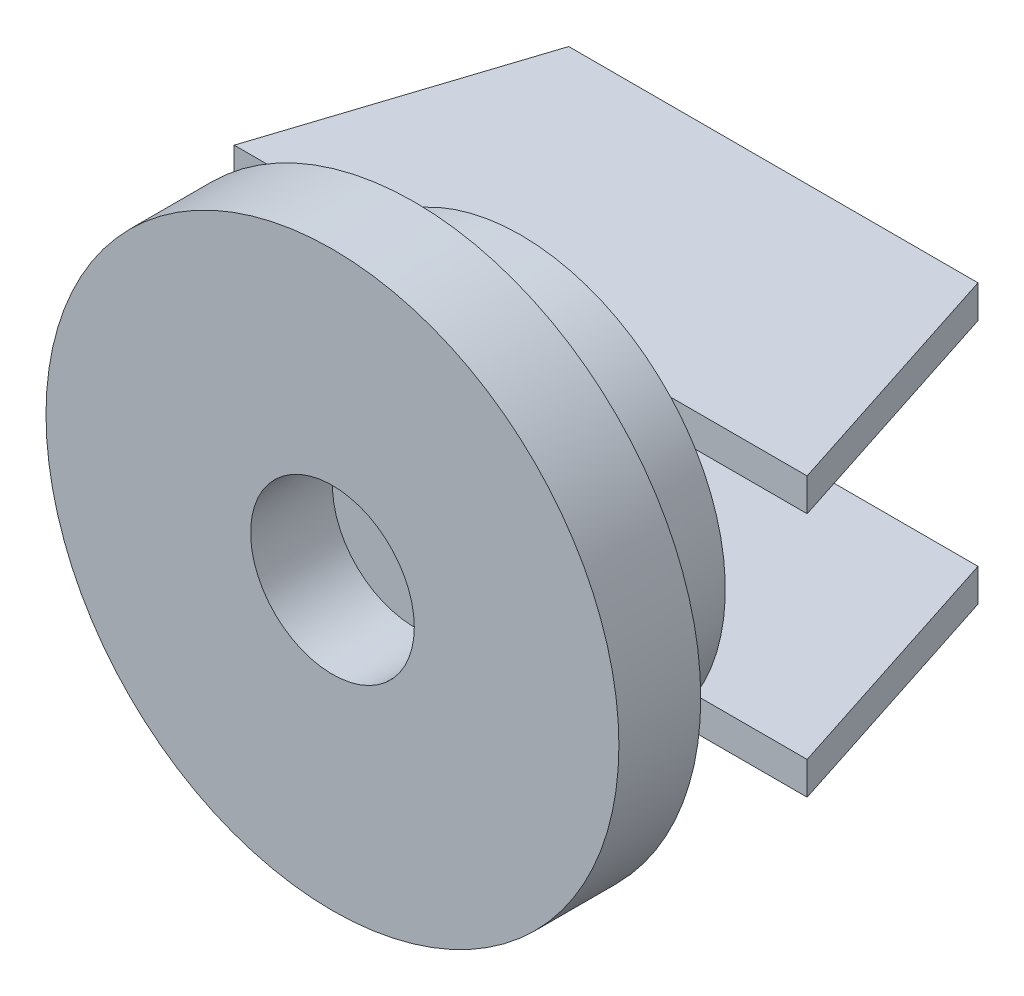
ISO-10303-21;
HEADER;
FILE_DESCRIPTION(('STEP AP214'),'2;1');
FILE_NAME('part.step','',(''),(''),'','','');
FILE_SCHEMA(('AUTOMOTIVE_DESIGN { 1 0 10303 214 1 1 1 1 }'));
ENDSEC;
DATA;
#1=APPLICATION_CONTEXT('core data for automotive mechanical design processes');
#2=APPLICATION_PROTOCOL_DEFINITION('international standard','automotive_design',2000,#1);
#3=PRODUCT_CONTEXT('',#1,'mechanical');
#4=PRODUCT('Part','Part','',(#3));
#5=PRODUCT_RELATED_PRODUCT_CATEGORY('part','',(#4));
#6=PRODUCT_DEFINITION_FORMATION('','',#4);
#7=PRODUCT_DEFINITION_CONTEXT('part definition',#1,'design');
#8=PRODUCT_DEFINITION('design','',#6,#7);
#9=PRODUCT_DEFINITION_SHAPE('','',#8);
#10=(LENGTH_UNIT() NAMED_UNIT(*) SI_UNIT(.MILLI.,.METRE.));
#11=(NAMED_UNIT(*) PLANE_ANGLE_UNIT() SI_UNIT($,.RADIAN.));
#12=(NAMED_UNIT(*) SI_UNIT($,.STERADIAN.) SOLID_ANGLE_UNIT());
#13=UNCERTAINTY_MEASURE_WITH_UNIT(LENGTH_MEASURE(1.E-05),#10,'distance_accuracy_value','');
#14=(GEOMETRIC_REPRESENTATION_CONTEXT(3) GLOBAL_UNCERTAINTY_ASSIGNED_CONTEXT((#13)) GLOBAL_UNIT_ASSIGNED_CONTEXT((#10,
#11,#12)) REPRESENTATION_CONTEXT('',''));
#15=CARTESIAN_POINT('',(0.,0.,0.));
#16=DIRECTION('',(0.,0.,1.));
#17=DIRECTION('',(1.,0.,0.));
#18=AXIS2_PLACEMENT_3D('',#15,#16,#17);
#19=CARTESIAN_POINT('',(0.,0.,-11.5));
#20=DIRECTION('',(0.,0.,-1.));
#21=DIRECTION('',(-1.,0.,0.));
#22=AXIS2_PLACEMENT_3D('',#19,#20,#21);
#23=PLANE('',#22);
#24=CARTESIAN_POINT('',(0.,0.,-11.5));
#25=DIRECTION('',(0.,0.,-1.));
#26=DIRECTION('',(-1.,0.,0.));
#27=AXIS2_PLACEMENT_3D('',#24,#25,#26);
#28=CIRCLE('',#27,6.5);
#29=CARTESIAN_POINT('',(0.,6.5,-11.5));
#30=VERTEX_POINT('',#29);
#31=CARTESIAN_POINT('',(0.,-6.5,-11.5));
#32=VERTEX_POINT('',#31);
#33=EDGE_CURVE('E31',#30,#32,#28,.T.);
#34=ORIENTED_EDGE('',*,*,#33,.F.);
#35=DIRECTION('',(-1.,0.,0.));
#36=VECTOR('',#35,1.);
#37=CARTESIAN_POINT('',(0.,6.5,-11.5));
#38=LINE('',#37,#36);
#39=CARTESIAN_POINT('',(10.6770782520313,6.5,-11.5));
#40=VERTEX_POINT('',#39);
#41=EDGE_CURVE('E38',#40,#30,#38,.T.);
#42=ORIENTED_EDGE('',*,*,#41,.F.);
#43=CARTESIAN_POINT('',(0.,0.,-11.5));
#44=DIRECTION('',(0.,0.,-1.));
#45=DIRECTION('',(-1.,0.,0.));
#46=AXIS2_PLACEMENT_3D('',#43,#44,#45);
#47=CIRCLE('',#46,12.5);
#48=CARTESIAN_POINT('',(10.6770782520313,-6.5,-11.5));
#49=VERTEX_POINT('',#48);
#50=EDGE_CURVE('E192',#40,#49,#47,.T.);
#51=ORIENTED_EDGE('',*,*,#50,.T.);
#52=DIRECTION('',(1.,0.,0.));
#53=VECTOR('',#52,1.);
#54=CARTESIAN_POINT('',(-17.5,-6.5,-11.5));
#55=LINE('',#54,#53);
#56=EDGE_CURVE('E116',#32,#49,#55,.T.);
#57=ORIENTED_EDGE('',*,*,#56,.F.);
#58=EDGE_LOOP('',(#34,#42,#51,#57));
#59=FACE_BOUND('',#58,.T.);
#60=ADVANCED_FACE('F17',(#59),#23,.T.);
#61=CARTESIAN_POINT('',(-9.16515138991169,8.5,-11.5));
#62=VERTEX_POINT('',#61);
#63=CARTESIAN_POINT('',(9.16515138991169,8.5,-11.5));
#64=VERTEX_POINT('',#63);
#65=EDGE_CURVE('E339',#62,#64,#47,.T.);
#66=ORIENTED_EDGE('',*,*,#65,.T.);
#67=DIRECTION('',(-1.,0.,0.));
#68=VECTOR('',#67,1.);
#69=CARTESIAN_POINT('',(0.,8.5,-11.5));
#70=LINE('',#69,#68);
#71=EDGE_CURVE('E134',#64,#62,#70,.T.);
#72=ORIENTED_EDGE('',*,*,#71,.T.);
#73=EDGE_LOOP('',(#66,#72));
#74=FACE_BOUND('',#73,.T.);
#75=ADVANCED_FACE('F225',(#74),#23,.T.);
#76=CARTESIAN_POINT('',(9.16515138991169,-8.5,-11.5));
#77=VERTEX_POINT('',#76);
#78=CARTESIAN_POINT('',(-9.16515138991169,-8.5,-11.5));
#79=VERTEX_POINT('',#78);
#80=EDGE_CURVE('E202',#77,#79,#47,.T.);
#81=ORIENTED_EDGE('',*,*,#80,.T.);
#82=DIRECTION('',(1.,0.,0.));
#83=VECTOR('',#82,1.);
#84=CARTESIAN_POINT('',(-17.5,-8.5,-11.5));
#85=LINE('',#84,#83);
#86=EDGE_CURVE('E183',#79,#77,#85,.T.);
#87=ORIENTED_EDGE('',*,*,#86,.T.);
#88=EDGE_LOOP('',(#81,#87));
#89=FACE_BOUND('',#88,.T.);
#90=ADVANCED_FACE('F216',(#89),#23,.T.);
#91=CARTESIAN_POINT('',(0.,0.,-5.));
#92=DIRECTION('',(0.,0.,1.));
#93=DIRECTION('',(1.,0.,0.));
#94=AXIS2_PLACEMENT_3D('',#91,#92,#93);
#95=CYLINDRICAL_SURFACE('',#94,17.5);
#96=CARTESIAN_POINT('',(0.,0.,-5.));
#97=DIRECTION('',(0.,0.,1.));
#98=DIRECTION('',(1.,0.,0.));
#99=AXIS2_PLACEMENT_3D('',#96,#97,#98);
#100=CIRCLE('',#99,17.5);
#101=CARTESIAN_POINT('',(17.5,0.,-5.));
#102=VERTEX_POINT('',#101);
#103=EDGE_CURVE('E205',#102,#102,#100,.T.);
#104=ORIENTED_EDGE('',*,*,#103,.T.);
#105=EDGE_LOOP('',(#104));
#106=FACE_BOUND('',#105,.T.);
#107=CARTESIAN_POINT('',(0.,0.,0.));
#108=DIRECTION('',(0.,0.,1.));
#109=DIRECTION('',(1.,0.,0.));
#110=AXIS2_PLACEMENT_3D('',#107,#108,#109);
#111=CIRCLE('',#110,17.5);
#112=CARTESIAN_POINT('',(17.5,0.,0.));
#113=VERTEX_POINT('',#112);
#114=EDGE_CURVE('E137',#113,#113,#111,.T.);
#115=ORIENTED_EDGE('',*,*,#114,.F.);
#116=EDGE_LOOP('',(#115));
#117=FACE_BOUND('',#116,.T.);
#118=ADVANCED_FACE('F19',(#106,#117),#95,.T.);
#119=CARTESIAN_POINT('',(0.,0.,-5.));
#120=DIRECTION('',(0.,0.,1.));
#121=DIRECTION('',(1.,0.,0.));
#122=AXIS2_PLACEMENT_3D('',#119,#120,#121);
#123=PLANE('',#122);
#124=CARTESIAN_POINT('',(0.,0.,-5.));
#125=DIRECTION('',(0.,0.,-1.));
#126=DIRECTION('',(-1.,0.,0.));
#127=AXIS2_PLACEMENT_3D('',#124,#125,#126);
#128=CIRCLE('',#127,12.5);
#129=CARTESIAN_POINT('',(-12.5,0.,-5.));
#130=VERTEX_POINT('',#129);
#131=EDGE_CURVE('E203',#130,#130,#128,.T.);
#132=ORIENTED_EDGE('',*,*,#131,.F.);
#133=EDGE_LOOP('',(#132));
#134=FACE_BOUND('',#133,.T.);
#135=ORIENTED_EDGE('',*,*,#103,.F.);
#136=EDGE_LOOP('',(#135));
#137=FACE_BOUND('',#136,.T.);
#138=ADVANCED_FACE('F215',(#134,#137),#123,.F.);
#139=CARTESIAN_POINT('',(0.,0.,0.));
#140=DIRECTION('',(0.,0.,1.));
#141=DIRECTION('',(1.,0.,0.));
#142=AXIS2_PLACEMENT_3D('',#139,#140,#141);
#143=PLANE('',#142);
#144=CARTESIAN_POINT('',(0.,0.,0.));
#145=DIRECTION('',(0.,0.,1.));
#146=DIRECTION('',(1.,0.,0.));
#147=AXIS2_PLACEMENT_3D('',#144,#145,#146);
#148=CIRCLE('',#147,5.);
#149=CARTESIAN_POINT('',(5.,0.,0.));
#150=VERTEX_POINT('',#149);
#151=EDGE_CURVE('E292',#150,#150,#148,.T.);
#152=ORIENTED_EDGE('',*,*,#151,.F.);
#153=EDGE_LOOP('',(#152));
#154=FACE_BOUND('',#153,.T.);
#155=ORIENTED_EDGE('',*,*,#114,.T.);
#156=EDGE_LOOP('',(#155));
#157=FACE_BOUND('',#156,.T.);
#158=ADVANCED_FACE('F212',(#154,#157),#143,.T.);
#159=CARTESIAN_POINT('',(0.,0.,-11.5));
#160=DIRECTION('',(0.,0.,1.));
#161=DIRECTION('',(1.,0.,0.));
#162=AXIS2_PLACEMENT_3D('',#159,#160,#161);
#163=CYLINDRICAL_SURFACE('',#162,12.5);
#164=EDGE_CURVE('E199',#49,#77,#47,.T.);
#165=ORIENTED_EDGE('',*,*,#164,.F.);
#166=ORIENTED_EDGE('',*,*,#50,.F.);
#167=EDGE_CURVE('E341',#64,#40,#47,.T.);
#168=ORIENTED_EDGE('',*,*,#167,.F.);
#169=ORIENTED_EDGE('',*,*,#65,.F.);
#170=CARTESIAN_POINT('',(-10.6770782520313,6.5,-11.5));
#171=VERTEX_POINT('',#170);
#172=EDGE_CURVE('E338',#171,#62,#47,.T.);
#173=ORIENTED_EDGE('',*,*,#172,.F.);
#174=CARTESIAN_POINT('',(-10.6770782520313,-6.5,-11.5));
#175=VERTEX_POINT('',#174);
#176=EDGE_CURVE('E123',#175,#171,#47,.T.);
#177=ORIENTED_EDGE('',*,*,#176,.F.);
#178=EDGE_CURVE('E337',#79,#175,#47,.T.);
#179=ORIENTED_EDGE('',*,*,#178,.F.);
#180=ORIENTED_EDGE('',*,*,#80,.F.);
#181=EDGE_LOOP('',(#165,#166,#168,#169,#173,#177,#179,#180));
#182=FACE_BOUND('',#181,.T.);
#183=ORIENTED_EDGE('',*,*,#131,.T.);
#184=EDGE_LOOP('',(#183));
#185=FACE_BOUND('',#184,.T.);
#186=ADVANCED_FACE('F238',(#182,#185),#163,.T.);
#187=EDGE_CURVE('E109',#32,#30,#28,.T.);
#188=ORIENTED_EDGE('',*,*,#187,.F.);
#189=EDGE_CURVE('E127',#175,#32,#55,.T.);
#190=ORIENTED_EDGE('',*,*,#189,.F.);
#191=ORIENTED_EDGE('',*,*,#176,.T.);
#192=EDGE_CURVE('E120',#30,#171,#38,.T.);
#193=ORIENTED_EDGE('',*,*,#192,.F.);
#194=EDGE_LOOP('',(#188,#190,#191,#193));
#195=FACE_BOUND('',#194,.T.);
#196=ADVANCED_FACE('F121',(#195),#23,.T.);
#197=CARTESIAN_POINT('',(-17.5,-8.5,-11.5));
#198=DIRECTION('',(0.,0.,1.));
#199=DIRECTION('',(1.,0.,0.));
#200=AXIS2_PLACEMENT_3D('',#197,#198,#199);
#201=PLANE('',#200);
#202=CARTESIAN_POINT('',(17.5,-6.5,-11.5));
#203=VERTEX_POINT('',#202);
#204=EDGE_CURVE('E186',#49,#203,#55,.T.);
#205=ORIENTED_EDGE('',*,*,#204,.F.);
#206=ORIENTED_EDGE('',*,*,#164,.T.);
#207=CARTESIAN_POINT('',(17.5,-8.5,-11.5));
#208=VERTEX_POINT('',#207);
#209=EDGE_CURVE('E177',#77,#208,#85,.T.);
#210=ORIENTED_EDGE('',*,*,#209,.T.);
#211=DIRECTION('',(0.,1.,0.));
#212=VECTOR('',#211,1.);
#213=CARTESIAN_POINT('',(17.5,-8.5,-11.5));
#214=LINE('',#213,#212);
#215=EDGE_CURVE('E189',#208,#203,#214,.T.);
#216=ORIENTED_EDGE('',*,*,#215,.T.);
#217=EDGE_LOOP('',(#205,#206,#210,#216));
#218=FACE_BOUND('',#217,.T.);
#219=ADVANCED_FACE('F237',(#218),#201,.T.);
#220=CARTESIAN_POINT('',(-17.5,-8.5,-11.5));
#221=VERTEX_POINT('',#220);
#222=EDGE_CURVE('E179',#221,#79,#85,.T.);
#223=ORIENTED_EDGE('',*,*,#222,.T.);
#224=ORIENTED_EDGE('',*,*,#178,.T.);
#225=CARTESIAN_POINT('',(-17.5,-6.5,-11.5));
#226=VERTEX_POINT('',#225);
#227=EDGE_CURVE('E178',#226,#175,#55,.T.);
#228=ORIENTED_EDGE('',*,*,#227,.F.);
#229=DIRECTION('',(0.,1.,0.));
#230=VECTOR('',#229,1.);
#231=CARTESIAN_POINT('',(-17.5,-8.5,-11.5));
#232=LINE('',#231,#230);
#233=EDGE_CURVE('E193',#221,#226,#232,.T.);
#234=ORIENTED_EDGE('',*,*,#233,.F.);
#235=EDGE_LOOP('',(#223,#224,#228,#234));
#236=FACE_BOUND('',#235,.T.);
#237=ADVANCED_FACE('F244',(#236),#201,.T.);
#238=CARTESIAN_POINT('',(12.5015600086486,-8.5,-26.9361006449416));
#239=DIRECTION('',(0.,0.,-1.));
#240=DIRECTION('',(-1.,0.,0.));
#241=AXIS2_PLACEMENT_3D('',#238,#239,#240);
#242=PLANE('',#241);
#243=DIRECTION('',(-1.,0.,0.));
#244=VECTOR('',#243,1.);
#245=CARTESIAN_POINT('',(12.5015600086486,-6.5,-26.9361006449416));
#246=LINE('',#245,#244);
#247=CARTESIAN_POINT('',(12.5015600086486,-6.5,-26.9361006449416));
#248=VERTEX_POINT('',#247);
#249=CARTESIAN_POINT('',(-12.5015600086486,-6.5,-26.9361006449416));
#250=VERTEX_POINT('',#249);
#251=EDGE_CURVE('E171',#248,#250,#246,.T.);
#252=ORIENTED_EDGE('',*,*,#251,.F.);
#253=DIRECTION('',(0.,1.,0.));
#254=VECTOR('',#253,1.);
#255=CARTESIAN_POINT('',(12.5015600086486,-8.5,-26.9361006449416));
#256=LINE('',#255,#254);
#257=CARTESIAN_POINT('',(12.5015600086486,-8.5,-26.9361006449416));
#258=VERTEX_POINT('',#257);
#259=EDGE_CURVE('E182',#258,#248,#256,.T.);
#260=ORIENTED_EDGE('',*,*,#259,.F.);
#261=DIRECTION('',(-1.,0.,0.));
#262=VECTOR('',#261,1.);
#263=CARTESIAN_POINT('',(12.5015600086486,-8.5,-26.9361006449416));
#264=LINE('',#263,#262);
#265=CARTESIAN_POINT('',(-12.5015600086486,-8.5,-26.9361006449416));
#266=VERTEX_POINT('',#265);
#267=EDGE_CURVE('E174',#258,#266,#264,.T.);
#268=ORIENTED_EDGE('',*,*,#267,.T.);
#269=DIRECTION('',(0.,1.,0.));
#270=VECTOR('',#269,1.);
#271=CARTESIAN_POINT('',(-12.5015600086486,-8.5,-26.9361006449416));
#272=LINE('',#271,#270);
#273=EDGE_CURVE('E195',#266,#250,#272,.T.);
#274=ORIENTED_EDGE('',*,*,#273,.T.);
#275=EDGE_LOOP('',(#252,#260,#268,#274));
#276=FACE_BOUND('',#275,.T.);
#277=ADVANCED_FACE('F324',(#276),#242,.T.);
#278=CARTESIAN_POINT('',(0.,-8.5,0.));
#279=DIRECTION('',(0.,1.,0.));
#280=DIRECTION('',(0.,0.,1.));
#281=AXIS2_PLACEMENT_3D('',#278,#279,#280);
#282=PLANE('',#281);
#283=ORIENTED_EDGE('',*,*,#267,.F.);
#284=DIRECTION('',(-0.308066177027205,0.,-0.951364930282719));
#285=VECTOR('',#284,1.);
#286=CARTESIAN_POINT('',(17.5,-8.5,-11.5));
#287=LINE('',#286,#285);
#288=EDGE_CURVE('E275',#208,#258,#287,.T.);
#289=ORIENTED_EDGE('',*,*,#288,.F.);
#290=ORIENTED_EDGE('',*,*,#209,.F.);
#291=ORIENTED_EDGE('',*,*,#86,.F.);
#292=ORIENTED_EDGE('',*,*,#222,.F.);
#293=DIRECTION('',(-0.308066177027205,0.,0.951364930282719));
#294=VECTOR('',#293,1.);
#295=CARTESIAN_POINT('',(-12.5015600086486,-8.5,-26.9361006449416));
#296=LINE('',#295,#294);
#297=EDGE_CURVE('E285',#266,#221,#296,.T.);
#298=ORIENTED_EDGE('',*,*,#297,.F.);
#299=EDGE_LOOP('',(#283,#289,#290,#291,#292,#298));
#300=FACE_BOUND('',#299,.T.);
#301=ADVANCED_FACE('F278',(#300),#282,.F.);
#302=CARTESIAN_POINT('',(0.,-6.5,0.));
#303=DIRECTION('',(0.,1.,0.));
#304=DIRECTION('',(0.,0.,1.));
#305=AXIS2_PLACEMENT_3D('',#302,#303,#304);
#306=PLANE('',#305);
#307=DIRECTION('',(0.308066177027205,0.,0.951364930282719));
#308=VECTOR('',#307,1.);
#309=CARTESIAN_POINT('',(19.2096251408517,-6.5,-6.22036359644795));
#310=LINE('',#309,#308);
#311=EDGE_CURVE('E270',#248,#203,#310,.T.);
#312=ORIENTED_EDGE('',*,*,#311,.F.);
#313=ORIENTED_EDGE('',*,*,#251,.T.);
#314=DIRECTION('',(0.308066177027205,0.,-0.951364930282719));
#315=VECTOR('',#314,1.);
#316=CARTESIAN_POINT('',(-19.2096251408517,-6.5,-6.22036359644795));
#317=LINE('',#316,#315);
#318=EDGE_CURVE('E283',#226,#250,#317,.T.);
#319=ORIENTED_EDGE('',*,*,#318,.F.);
#320=ORIENTED_EDGE('',*,*,#227,.T.);
#321=ORIENTED_EDGE('',*,*,#189,.T.);
#322=ORIENTED_EDGE('',*,*,#56,.T.);
#323=ORIENTED_EDGE('',*,*,#204,.T.);
#324=EDGE_LOOP('',(#312,#313,#319,#320,#321,#322,#323));
#325=FACE_BOUND('',#324,.T.);
#326=ADVANCED_FACE('F269',(#325),#306,.T.);
#327=CARTESIAN_POINT('',(-17.5,8.5,-11.5));
#328=DIRECTION('',(0.,0.,-1.));
#329=DIRECTION('',(-1.,0.,0.));
#330=AXIS2_PLACEMENT_3D('',#327,#328,#329);
#331=PLANE('',#330);
#332=DIRECTION('',(1.,0.,0.));
#333=VECTOR('',#332,1.);
#334=CARTESIAN_POINT('',(-17.5,6.5,-11.5));
#335=LINE('',#334,#333);
#336=CARTESIAN_POINT('',(-17.5,6.5,-11.5));
#337=VERTEX_POINT('',#336);
#338=EDGE_CURVE('E154',#337,#171,#335,.T.);
#339=ORIENTED_EDGE('',*,*,#338,.T.);
#340=ORIENTED_EDGE('',*,*,#172,.T.);
#341=DIRECTION('',(1.,0.,0.));
#342=VECTOR('',#341,1.);
#343=CARTESIAN_POINT('',(-17.5,8.5,-11.5));
#344=LINE('',#343,#342);
#345=CARTESIAN_POINT('',(-17.5,8.5,-11.5));
#346=VERTEX_POINT('',#345);
#347=EDGE_CURVE('E156',#346,#62,#344,.T.);
#348=ORIENTED_EDGE('',*,*,#347,.F.);
#349=DIRECTION('',(0.,-1.,0.));
#350=VECTOR('',#349,1.);
#351=CARTESIAN_POINT('',(-17.5,8.5,-11.5));
#352=LINE('',#351,#350);
#353=EDGE_CURVE('E143',#346,#337,#352,.T.);
#354=ORIENTED_EDGE('',*,*,#353,.T.);
#355=EDGE_LOOP('',(#339,#340,#348,#354));
#356=FACE_BOUND('',#355,.T.);
#357=ADVANCED_FACE('F152',(#356),#331,.F.);
#358=CARTESIAN_POINT('',(12.5015600086486,8.5,-26.9361006449416));
#359=DIRECTION('',(0.,0.,1.));
#360=DIRECTION('',(1.,0.,0.));
#361=AXIS2_PLACEMENT_3D('',#358,#359,#360);
#362=PLANE('',#361);
#363=DIRECTION('',(-1.,0.,0.));
#364=VECTOR('',#363,1.);
#365=CARTESIAN_POINT('',(12.5015600086486,6.5,-26.9361006449416));
#366=LINE('',#365,#364);
#367=CARTESIAN_POINT('',(12.5015600086486,6.5,-26.9361006449416));
#368=VERTEX_POINT('',#367);
#369=CARTESIAN_POINT('',(-12.5015600086486,6.5,-26.9361006449416));
#370=VERTEX_POINT('',#369);
#371=EDGE_CURVE('E159',#368,#370,#366,.T.);
#372=ORIENTED_EDGE('',*,*,#371,.T.);
#373=DIRECTION('',(0.,-1.,0.));
#374=VECTOR('',#373,1.);
#375=CARTESIAN_POINT('',(-12.5015600086486,8.5,-26.9361006449416));
#376=LINE('',#375,#374);
#377=CARTESIAN_POINT('',(-12.5015600086486,8.5,-26.9361006449416));
#378=VERTEX_POINT('',#377);
#379=EDGE_CURVE('E146',#378,#370,#376,.T.);
#380=ORIENTED_EDGE('',*,*,#379,.F.);
#381=DIRECTION('',(-1.,0.,0.));
#382=VECTOR('',#381,1.);
#383=CARTESIAN_POINT('',(12.5015600086486,8.5,-26.9361006449416));
#384=LINE('',#383,#382);
#385=CARTESIAN_POINT('',(12.5015600086486,8.5,-26.9361006449416));
#386=VERTEX_POINT('',#385);
#387=EDGE_CURVE('E165',#386,#378,#384,.T.);
#388=ORIENTED_EDGE('',*,*,#387,.F.);
#389=DIRECTION('',(0.,-1.,0.));
#390=VECTOR('',#389,1.);
#391=CARTESIAN_POINT('',(12.5015600086486,8.5,-26.9361006449416));
#392=LINE('',#391,#390);
#393=EDGE_CURVE('E168',#386,#368,#392,.T.);
#394=ORIENTED_EDGE('',*,*,#393,.T.);
#395=EDGE_LOOP('',(#372,#380,#388,#394));
#396=FACE_BOUND('',#395,.T.);
#397=ADVANCED_FACE('F310',(#396),#362,.F.);
#398=CARTESIAN_POINT('',(17.5,8.5,-11.5));
#399=VERTEX_POINT('',#398);
#400=EDGE_CURVE('E161',#64,#399,#344,.T.);
#401=ORIENTED_EDGE('',*,*,#400,.F.);
#402=ORIENTED_EDGE('',*,*,#167,.T.);
#403=CARTESIAN_POINT('',(17.5,6.5,-11.5));
#404=VERTEX_POINT('',#403);
#405=EDGE_CURVE('E133',#40,#404,#335,.T.);
#406=ORIENTED_EDGE('',*,*,#405,.T.);
#407=DIRECTION('',(0.,-1.,0.));
#408=VECTOR('',#407,1.);
#409=CARTESIAN_POINT('',(17.5,8.5,-11.5));
#410=LINE('',#409,#408);
#411=EDGE_CURVE('E157',#399,#404,#410,.T.);
#412=ORIENTED_EDGE('',*,*,#411,.F.);
#413=EDGE_LOOP('',(#401,#402,#406,#412));
#414=FACE_BOUND('',#413,.T.);
#415=ADVANCED_FACE('F306',(#414),#331,.F.);
#416=CARTESIAN_POINT('',(0.,8.5,0.));
#417=DIRECTION('',(0.,-1.,0.));
#418=DIRECTION('',(0.,0.,1.));
#419=AXIS2_PLACEMENT_3D('',#416,#417,#418);
#420=PLANE('',#419);
#421=ORIENTED_EDGE('',*,*,#400,.T.);
#422=DIRECTION('',(0.308066177027205,0.,0.951364930282719));
#423=VECTOR('',#422,1.);
#424=CARTESIAN_POINT('',(17.5,8.5,-11.5));
#425=LINE('',#424,#423);
#426=EDGE_CURVE('E280',#386,#399,#425,.T.);
#427=ORIENTED_EDGE('',*,*,#426,.F.);
#428=ORIENTED_EDGE('',*,*,#387,.T.);
#429=DIRECTION('',(0.308066177027205,0.,-0.951364930282719));
#430=VECTOR('',#429,1.);
#431=CARTESIAN_POINT('',(-12.5015600086486,8.5,-26.9361006449416));
#432=LINE('',#431,#430);
#433=EDGE_CURVE('E281',#346,#378,#432,.T.);
#434=ORIENTED_EDGE('',*,*,#433,.F.);
#435=ORIENTED_EDGE('',*,*,#347,.T.);
#436=ORIENTED_EDGE('',*,*,#71,.F.);
#437=EDGE_LOOP('',(#421,#427,#428,#434,#435,#436));
#438=FACE_BOUND('',#437,.T.);
#439=ADVANCED_FACE('F303',(#438),#420,.F.);
#440=CARTESIAN_POINT('',(0.,6.5,0.));
#441=DIRECTION('',(0.,-1.,0.));
#442=DIRECTION('',(0.,0.,1.));
#443=AXIS2_PLACEMENT_3D('',#440,#441,#442);
#444=PLANE('',#443);
#445=DIRECTION('',(-0.308066177027205,0.,-0.951364930282719));
#446=VECTOR('',#445,1.);
#447=CARTESIAN_POINT('',(19.2096251408517,6.5,-6.22036359644795));
#448=LINE('',#447,#446);
#449=EDGE_CURVE('E11',#404,#368,#448,.T.);
#450=ORIENTED_EDGE('',*,*,#449,.F.);
#451=ORIENTED_EDGE('',*,*,#405,.F.);
#452=ORIENTED_EDGE('',*,*,#41,.T.);
#453=ORIENTED_EDGE('',*,*,#192,.T.);
#454=ORIENTED_EDGE('',*,*,#338,.F.);
#455=DIRECTION('',(-0.308066177027205,0.,0.951364930282719));
#456=VECTOR('',#455,1.);
#457=CARTESIAN_POINT('',(-19.2096251408517,6.5,-6.22036359644795));
#458=LINE('',#457,#456);
#459=EDGE_CURVE('E25',#370,#337,#458,.T.);
#460=ORIENTED_EDGE('',*,*,#459,.F.);
#461=ORIENTED_EDGE('',*,*,#371,.F.);
#462=EDGE_LOOP('',(#450,#451,#452,#453,#454,#460,#461));
#463=FACE_BOUND('',#462,.T.);
#464=ADVANCED_FACE('F131',(#463),#444,.T.);
#465=CARTESIAN_POINT('',(0.,0.,-5.));
#466=DIRECTION('',(0.,0.,1.));
#467=DIRECTION('',(1.,0.,0.));
#468=AXIS2_PLACEMENT_3D('',#465,#466,#467);
#469=CYLINDRICAL_SURFACE('',#468,5.);
#470=CARTESIAN_POINT('',(0.,0.,-5.));
#471=DIRECTION('',(0.,0.,1.));
#472=DIRECTION('',(1.,0.,0.));
#473=AXIS2_PLACEMENT_3D('',#470,#471,#472);
#474=CIRCLE('',#473,5.);
#475=CARTESIAN_POINT('',(5.,0.,-5.));
#476=VERTEX_POINT('',#475);
#477=EDGE_CURVE('E163',#476,#476,#474,.T.);
#478=ORIENTED_EDGE('',*,*,#477,.F.);
#479=EDGE_LOOP('',(#478));
#480=FACE_BOUND('',#479,.T.);
#481=ORIENTED_EDGE('',*,*,#151,.T.);
#482=EDGE_LOOP('',(#481));
#483=FACE_BOUND('',#482,.T.);
#484=ADVANCED_FACE('F359',(#480,#483),#469,.F.);
#485=CARTESIAN_POINT('',(0.,0.,-5.));
#486=DIRECTION('',(0.,0.,1.));
#487=DIRECTION('',(1.,0.,0.));
#488=AXIS2_PLACEMENT_3D('',#485,#486,#487);
#489=PLANE('',#488);
#490=ORIENTED_EDGE('',*,*,#477,.T.);
#491=EDGE_LOOP('',(#490));
#492=FACE_BOUND('',#491,.T.);
#493=ADVANCED_FACE('F354',(#492),#489,.T.);
#494=CARTESIAN_POINT('',(-12.5015600086486,27.0058672041774,-26.9361006449416));
#495=DIRECTION('',(0.951364930282719,0.,0.308066177027205));
#496=DIRECTION('',(0.308066177027205,0.,-0.951364930282719));
#497=AXIS2_PLACEMENT_3D('',#494,#495,#496);
#498=PLANE('',#497);
#499=ORIENTED_EDGE('',*,*,#459,.T.);
#500=ORIENTED_EDGE('',*,*,#353,.F.);
#501=ORIENTED_EDGE('',*,*,#433,.T.);
#502=ORIENTED_EDGE('',*,*,#379,.T.);
#503=EDGE_LOOP('',(#499,#500,#501,#502));
#504=FACE_BOUND('',#503,.T.);
#505=ADVANCED_FACE('F142',(#504),#498,.F.);
#506=CARTESIAN_POINT('',(17.5,27.0058672041774,-11.5));
#507=DIRECTION('',(-0.951364930282719,0.,0.308066177027205));
#508=DIRECTION('',(0.308066177027205,0.,0.951364930282719));
#509=AXIS2_PLACEMENT_3D('',#506,#507,#508);
#510=PLANE('',#509);
#511=ORIENTED_EDGE('',*,*,#449,.T.);
#512=ORIENTED_EDGE('',*,*,#393,.F.);
#513=ORIENTED_EDGE('',*,*,#426,.T.);
#514=ORIENTED_EDGE('',*,*,#411,.T.);
#515=EDGE_LOOP('',(#511,#512,#513,#514));
#516=FACE_BOUND('',#515,.T.);
#517=ADVANCED_FACE('F308',(#516),#510,.F.);
#518=ORIENTED_EDGE('',*,*,#318,.T.);
#519=ORIENTED_EDGE('',*,*,#273,.F.);
#520=ORIENTED_EDGE('',*,*,#297,.T.);
#521=ORIENTED_EDGE('',*,*,#233,.T.);
#522=EDGE_LOOP('',(#518,#519,#520,#521));
#523=FACE_BOUND('',#522,.T.);
#524=ADVANCED_FACE('F343',(#523),#498,.F.);
#525=ORIENTED_EDGE('',*,*,#311,.T.);
#526=ORIENTED_EDGE('',*,*,#215,.F.);
#527=ORIENTED_EDGE('',*,*,#288,.T.);
#528=ORIENTED_EDGE('',*,*,#259,.T.);
#529=EDGE_LOOP('',(#525,#526,#527,#528));
#530=FACE_BOUND('',#529,.T.);
#531=ADVANCED_FACE('F274',(#530),#510,.F.);
#532=CARTESIAN_POINT('',(0.,0.,-9.));
#533=DIRECTION('',(0.,0.,-1.));
#534=DIRECTION('',(-1.,0.,0.));
#535=AXIS2_PLACEMENT_3D('',#532,#533,#534);
#536=CYLINDRICAL_SURFACE('',#535,6.5);
#537=CARTESIAN_POINT('',(0.,0.,-9.));
#538=DIRECTION('',(0.,0.,-1.));
#539=DIRECTION('',(-1.,0.,0.));
#540=AXIS2_PLACEMENT_3D('',#537,#538,#539);
#541=CIRCLE('',#540,6.5);
#542=CARTESIAN_POINT('',(-6.5,0.,-9.));
#543=VERTEX_POINT('',#542);
#544=EDGE_CURVE('E118',#543,#543,#541,.T.);
#545=ORIENTED_EDGE('',*,*,#544,.F.);
#546=EDGE_LOOP('',(#545));
#547=FACE_BOUND('',#546,.T.);
#548=ORIENTED_EDGE('',*,*,#33,.T.);
#549=ORIENTED_EDGE('',*,*,#187,.T.);
#550=EDGE_LOOP('',(#548,#549));
#551=FACE_BOUND('',#550,.T.);
#552=ADVANCED_FACE('F110',(#547,#551),#536,.F.);
#553=CARTESIAN_POINT('',(0.,0.,-9.));
#554=DIRECTION('',(0.,0.,-1.));
#555=DIRECTION('',(-1.,0.,0.));
#556=AXIS2_PLACEMENT_3D('',#553,#554,#555);
#557=PLANE('',#556);
#558=ORIENTED_EDGE('',*,*,#544,.T.);
#559=EDGE_LOOP('',(#558));
#560=FACE_BOUND('',#559,.T.);
#561=ADVANCED_FACE('F416',(#560),#557,.T.);
#562=CLOSED_SHELL('',(#60,#75,#90,#118,#138,#158,#186,#196,#219,#237,#277,#301,#326,#357,#397,
#415,#439,#464,#484,#493,#505,#517,#524,#531,#552,#561));
#563=MANIFOLD_SOLID_BREP('B1',#562);
#564=ADVANCED_BREP_SHAPE_REPRESENTATION('',(#18,#563),#14);
#565=SHAPE_DEFINITION_REPRESENTATION(#9,#564);
ENDSEC;
END-ISO-10303-21;
